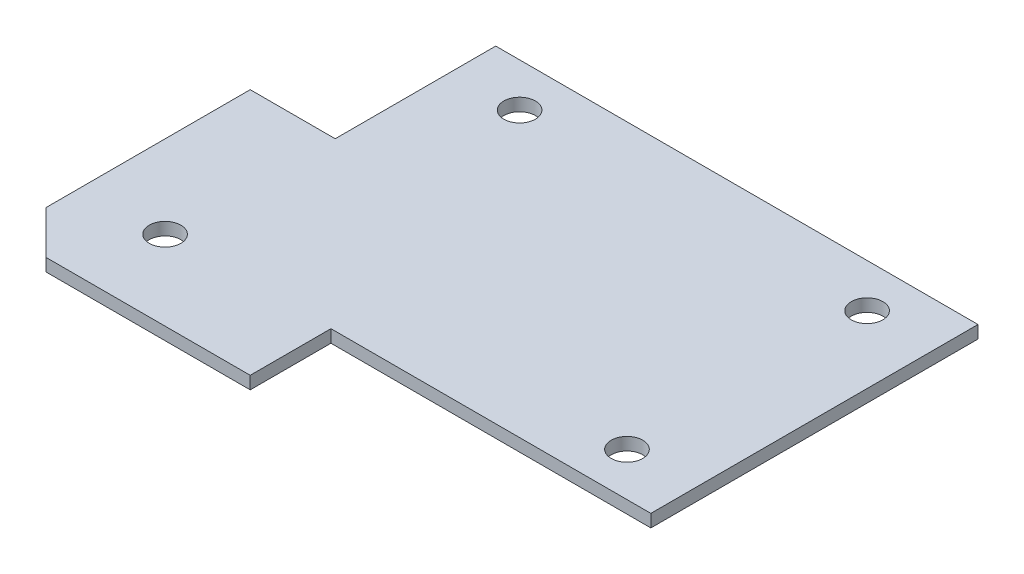
ISO-10303-21;
HEADER;
FILE_DESCRIPTION(('STEP AP214'),'2;1');
FILE_NAME('part.step','',(''),(''),'','','');
FILE_SCHEMA(('AUTOMOTIVE_DESIGN { 1 0 10303 214 1 1 1 1 }'));
ENDSEC;
DATA;
#1=APPLICATION_CONTEXT('core data for automotive mechanical design processes');
#2=APPLICATION_PROTOCOL_DEFINITION('international standard','automotive_design',2000,#1);
#3=PRODUCT_CONTEXT('',#1,'mechanical');
#4=PRODUCT('Part','Part','',(#3));
#5=PRODUCT_RELATED_PRODUCT_CATEGORY('part','',(#4));
#6=PRODUCT_DEFINITION_FORMATION('','',#4);
#7=PRODUCT_DEFINITION_CONTEXT('part definition',#1,'design');
#8=PRODUCT_DEFINITION('design','',#6,#7);
#9=PRODUCT_DEFINITION_SHAPE('','',#8);
#10=(LENGTH_UNIT() NAMED_UNIT(*) SI_UNIT(.MILLI.,.METRE.));
#11=(NAMED_UNIT(*) PLANE_ANGLE_UNIT() SI_UNIT($,.RADIAN.));
#12=(NAMED_UNIT(*) SI_UNIT($,.STERADIAN.) SOLID_ANGLE_UNIT());
#13=UNCERTAINTY_MEASURE_WITH_UNIT(LENGTH_MEASURE(1.E-05),#10,'distance_accuracy_value','');
#14=(GEOMETRIC_REPRESENTATION_CONTEXT(3) GLOBAL_UNCERTAINTY_ASSIGNED_CONTEXT((#13)) GLOBAL_UNIT_ASSIGNED_CONTEXT((#10,
#11,#12)) REPRESENTATION_CONTEXT('',''));
#15=CARTESIAN_POINT('',(0.,0.,0.));
#16=DIRECTION('',(0.,0.,1.));
#17=DIRECTION('',(1.,0.,0.));
#18=AXIS2_PLACEMENT_3D('',#15,#16,#17);
#19=CARTESIAN_POINT('',(-29.4806035931873,4.,-0.0264334137700193));
#20=DIRECTION('',(1.,0.,0.));
#21=DIRECTION('',(0.,0.,-1.));
#22=AXIS2_PLACEMENT_3D('',#19,#20,#21);
#23=PLANE('',#22);
#24=DIRECTION('',(0.,0.,1.));
#25=VECTOR('',#24,1.);
#26=CARTESIAN_POINT('',(-29.4806035931873,2.,-0.0264334137700193));
#27=LINE('',#26,#25);
#28=CARTESIAN_POINT('',(-29.4806035931873,2.,-25.4359182046136));
#29=VERTEX_POINT('',#28);
#30=CARTESIAN_POINT('',(-29.4806035931873,2.,-0.0264334137700193));
#31=VERTEX_POINT('',#30);
#32=EDGE_CURVE('E55',#29,#31,#27,.T.);
#33=ORIENTED_EDGE('',*,*,#32,.T.);
#34=DIRECTION('',(0.,-1.,0.));
#35=VECTOR('',#34,1.);
#36=CARTESIAN_POINT('',(-29.4806035931873,4.,-0.0264334137700193));
#37=LINE('',#36,#35);
#38=CARTESIAN_POINT('',(-29.4806035931873,4.,-0.0264334137700193));
#39=VERTEX_POINT('',#38);
#40=EDGE_CURVE('E11',#39,#31,#37,.T.);
#41=ORIENTED_EDGE('',*,*,#40,.F.);
#42=DIRECTION('',(0.,0.,1.));
#43=VECTOR('',#42,1.);
#44=CARTESIAN_POINT('',(-29.4806035931873,4.,-0.0264334137700193));
#45=LINE('',#44,#43);
#46=CARTESIAN_POINT('',(-29.4806035931873,4.,-25.4359182046136));
#47=VERTEX_POINT('',#46);
#48=EDGE_CURVE('E152',#47,#39,#45,.T.);
#49=ORIENTED_EDGE('',*,*,#48,.F.);
#50=DIRECTION('',(0.,-1.,0.));
#51=VECTOR('',#50,1.);
#52=CARTESIAN_POINT('',(-29.4806035931873,4.,-25.4359182046136));
#53=LINE('',#52,#51);
#54=EDGE_CURVE('E167',#47,#29,#53,.T.);
#55=ORIENTED_EDGE('',*,*,#54,.T.);
#56=EDGE_LOOP('',(#33,#41,#49,#55));
#57=FACE_BOUND('',#56,.T.);
#58=ADVANCED_FACE('F41',(#57),#23,.F.);
#59=CARTESIAN_POINT('',(-42.9335057092703,4.,-0.0264334137700193));
#60=DIRECTION('',(0.,0.,1.));
#61=DIRECTION('',(1.,0.,0.));
#62=AXIS2_PLACEMENT_3D('',#59,#60,#61);
#63=PLANE('',#62);
#64=DIRECTION('',(-1.,0.,0.));
#65=VECTOR('',#64,1.);
#66=CARTESIAN_POINT('',(-42.9335057092703,2.,-0.0264334137700193));
#67=LINE('',#66,#65);
#68=CARTESIAN_POINT('',(-42.9335057092703,2.,-0.0264334137700176));
#69=VERTEX_POINT('',#68);
#70=EDGE_CURVE('E169',#31,#69,#67,.T.);
#71=ORIENTED_EDGE('',*,*,#70,.T.);
#72=DIRECTION('',(0.,-1.,0.));
#73=VECTOR('',#72,1.);
#74=CARTESIAN_POINT('',(-42.9335057092703,4.,-0.0264334137700193));
#75=LINE('',#74,#73);
#76=CARTESIAN_POINT('',(-42.9335057092703,4.,-0.0264334137700193));
#77=VERTEX_POINT('',#76);
#78=EDGE_CURVE('E48',#77,#69,#75,.T.);
#79=ORIENTED_EDGE('',*,*,#78,.F.);
#80=DIRECTION('',(-1.,0.,0.));
#81=VECTOR('',#80,1.);
#82=CARTESIAN_POINT('',(-42.9335057092703,4.,-0.0264334137700193));
#83=LINE('',#82,#81);
#84=EDGE_CURVE('E154',#39,#77,#83,.T.);
#85=ORIENTED_EDGE('',*,*,#84,.F.);
#86=ORIENTED_EDGE('',*,*,#40,.T.);
#87=EDGE_LOOP('',(#71,#79,#85,#86));
#88=FACE_BOUND('',#87,.T.);
#89=ADVANCED_FACE('F201',(#88),#63,.F.);
#90=CARTESIAN_POINT('',(-42.9335057092703,4.,32.2961580116147));
#91=DIRECTION('',(1.,0.,0.));
#92=DIRECTION('',(0.,0.,-1.));
#93=AXIS2_PLACEMENT_3D('',#90,#91,#92);
#94=PLANE('',#93);
#95=DIRECTION('',(0.,0.,1.));
#96=VECTOR('',#95,1.);
#97=CARTESIAN_POINT('',(-42.9335057092703,2.,32.2961580116147));
#98=LINE('',#97,#96);
#99=CARTESIAN_POINT('',(-42.9335057092703,2.,32.2961580116147));
#100=VERTEX_POINT('',#99);
#101=EDGE_CURVE('E172',#69,#100,#98,.T.);
#102=ORIENTED_EDGE('',*,*,#101,.T.);
#103=DIRECTION('',(0.,-1.,0.));
#104=VECTOR('',#103,1.);
#105=CARTESIAN_POINT('',(-42.9335057092703,4.,32.2961580116147));
#106=LINE('',#105,#104);
#107=CARTESIAN_POINT('',(-42.9335057092703,4.,32.2961580116147));
#108=VERTEX_POINT('',#107);
#109=EDGE_CURVE('E192',#108,#100,#106,.T.);
#110=ORIENTED_EDGE('',*,*,#109,.F.);
#111=DIRECTION('',(0.,0.,1.));
#112=VECTOR('',#111,1.);
#113=CARTESIAN_POINT('',(-42.9335057092703,4.,32.2961580116147));
#114=LINE('',#113,#112);
#115=EDGE_CURVE('E156',#77,#108,#114,.T.);
#116=ORIENTED_EDGE('',*,*,#115,.F.);
#117=ORIENTED_EDGE('',*,*,#78,.T.);
#118=EDGE_LOOP('',(#102,#110,#116,#117));
#119=FACE_BOUND('',#118,.T.);
#120=ADVANCED_FACE('F198',(#119),#94,.F.);
#121=CARTESIAN_POINT('',(-36.1050785845241,4.,39.1245851363609));
#122=DIRECTION('',(0.707106781186547,0.,-0.707106781186548));
#123=DIRECTION('',(-0.707106781186548,0.,-0.707106781186547));
#124=AXIS2_PLACEMENT_3D('',#121,#122,#123);
#125=PLANE('',#124);
#126=DIRECTION('',(0.707106781186548,0.,0.707106781186547));
#127=VECTOR('',#126,1.);
#128=CARTESIAN_POINT('',(-36.1050785845241,2.,39.1245851363609));
#129=LINE('',#128,#127);
#130=CARTESIAN_POINT('',(-36.1050785845241,2.,39.1245851363609));
#131=VERTEX_POINT('',#130);
#132=EDGE_CURVE('E175',#100,#131,#129,.T.);
#133=ORIENTED_EDGE('',*,*,#132,.T.);
#134=DIRECTION('',(0.,-1.,0.));
#135=VECTOR('',#134,1.);
#136=CARTESIAN_POINT('',(-36.1050785845241,4.,39.1245851363609));
#137=LINE('',#136,#135);
#138=CARTESIAN_POINT('',(-36.1050785845241,4.,39.1245851363609));
#139=VERTEX_POINT('',#138);
#140=EDGE_CURVE('E189',#139,#131,#137,.T.);
#141=ORIENTED_EDGE('',*,*,#140,.F.);
#142=DIRECTION('',(0.707106781186548,0.,0.707106781186547));
#143=VECTOR('',#142,1.);
#144=CARTESIAN_POINT('',(-36.1050785845241,4.,39.1245851363609));
#145=LINE('',#144,#143);
#146=EDGE_CURVE('E158',#108,#139,#145,.T.);
#147=ORIENTED_EDGE('',*,*,#146,.F.);
#148=ORIENTED_EDGE('',*,*,#109,.T.);
#149=EDGE_LOOP('',(#133,#141,#147,#148));
#150=FACE_BOUND('',#149,.T.);
#151=ADVANCED_FACE('F205',(#150),#125,.F.);
#152=CARTESIAN_POINT('',(-3.78248715913939,4.,39.1245851363609));
#153=DIRECTION('',(0.,0.,-1.));
#154=DIRECTION('',(-1.,0.,0.));
#155=AXIS2_PLACEMENT_3D('',#152,#153,#154);
#156=PLANE('',#155);
#157=DIRECTION('',(1.,0.,0.));
#158=VECTOR('',#157,1.);
#159=CARTESIAN_POINT('',(-3.78248715913939,2.,39.1245851363609));
#160=LINE('',#159,#158);
#161=CARTESIAN_POINT('',(-3.78248715913939,2.,39.1245851363609));
#162=VERTEX_POINT('',#161);
#163=EDGE_CURVE('E178',#131,#162,#160,.T.);
#164=ORIENTED_EDGE('',*,*,#163,.T.);
#165=DIRECTION('',(0.,-1.,0.));
#166=VECTOR('',#165,1.);
#167=CARTESIAN_POINT('',(-3.78248715913939,4.,39.1245851363609));
#168=LINE('',#167,#166);
#169=CARTESIAN_POINT('',(-3.78248715913939,4.,39.1245851363609));
#170=VERTEX_POINT('',#169);
#171=EDGE_CURVE('E186',#170,#162,#168,.T.);
#172=ORIENTED_EDGE('',*,*,#171,.F.);
#173=DIRECTION('',(1.,0.,0.));
#174=VECTOR('',#173,1.);
#175=CARTESIAN_POINT('',(-3.78248715913939,4.,39.1245851363609));
#176=LINE('',#175,#174);
#177=EDGE_CURVE('E160',#139,#170,#176,.T.);
#178=ORIENTED_EDGE('',*,*,#177,.F.);
#179=ORIENTED_EDGE('',*,*,#140,.T.);
#180=EDGE_LOOP('',(#164,#172,#178,#179));
#181=FACE_BOUND('',#180,.T.);
#182=ADVANCED_FACE('F209',(#181),#156,.F.);
#183=CARTESIAN_POINT('',(-3.78248715913939,4.,26.3446667504336));
#184=DIRECTION('',(-1.,0.,0.));
#185=DIRECTION('',(0.,0.,1.));
#186=AXIS2_PLACEMENT_3D('',#183,#184,#185);
#187=PLANE('',#186);
#188=DIRECTION('',(0.,0.,-1.));
#189=VECTOR('',#188,1.);
#190=CARTESIAN_POINT('',(-3.78248715913939,2.,26.3446667504336));
#191=LINE('',#190,#189);
#192=CARTESIAN_POINT('',(-3.78248715913939,2.,26.3446667504336));
#193=VERTEX_POINT('',#192);
#194=EDGE_CURVE('E123',#162,#193,#191,.T.);
#195=ORIENTED_EDGE('',*,*,#194,.T.);
#196=DIRECTION('',(0.,-1.,0.));
#197=VECTOR('',#196,1.);
#198=CARTESIAN_POINT('',(-3.78248715913939,4.,26.3446667504336));
#199=LINE('',#198,#197);
#200=CARTESIAN_POINT('',(-3.78248715913939,4.,26.3446667504336));
#201=VERTEX_POINT('',#200);
#202=EDGE_CURVE('E120',#201,#193,#199,.T.);
#203=ORIENTED_EDGE('',*,*,#202,.F.);
#204=DIRECTION('',(0.,0.,-1.));
#205=VECTOR('',#204,1.);
#206=CARTESIAN_POINT('',(-3.78248715913939,4.,26.3446667504336));
#207=LINE('',#206,#205);
#208=EDGE_CURVE('E162',#170,#201,#207,.T.);
#209=ORIENTED_EDGE('',*,*,#208,.F.);
#210=ORIENTED_EDGE('',*,*,#171,.T.);
#211=EDGE_LOOP('',(#195,#203,#209,#210));
#212=FACE_BOUND('',#211,.T.);
#213=ADVANCED_FACE('F226',(#212),#187,.F.);
#214=CARTESIAN_POINT('',(31.8509323404461,4.,26.3446667504336));
#215=DIRECTION('',(0.,0.,-1.));
#216=DIRECTION('',(-1.,0.,0.));
#217=AXIS2_PLACEMENT_3D('',#214,#215,#216);
#218=PLANE('',#217);
#219=DIRECTION('',(1.,0.,0.));
#220=VECTOR('',#219,1.);
#221=CARTESIAN_POINT('',(31.8509323404461,2.,26.3446667504336));
#222=LINE('',#221,#220);
#223=CARTESIAN_POINT('',(46.8509323404461,2.,26.3446667504336));
#224=VERTEX_POINT('',#223);
#225=EDGE_CURVE('E112',#193,#224,#222,.T.);
#226=ORIENTED_EDGE('',*,*,#225,.T.);
#227=DIRECTION('',(0.,1.,0.));
#228=VECTOR('',#227,1.);
#229=CARTESIAN_POINT('',(46.8509323404461,-51.9094516600463,26.3446667504336));
#230=LINE('',#229,#228);
#231=CARTESIAN_POINT('',(46.8509323404461,4.,26.3446667504336));
#232=VERTEX_POINT('',#231);
#233=EDGE_CURVE('E117',#224,#232,#230,.T.);
#234=ORIENTED_EDGE('',*,*,#233,.T.);
#235=DIRECTION('',(1.,0.,0.));
#236=VECTOR('',#235,1.);
#237=CARTESIAN_POINT('',(31.8509323404461,4.,26.3446667504336));
#238=LINE('',#237,#236);
#239=EDGE_CURVE('E164',#201,#232,#238,.T.);
#240=ORIENTED_EDGE('',*,*,#239,.F.);
#241=ORIENTED_EDGE('',*,*,#202,.T.);
#242=EDGE_LOOP('',(#226,#234,#240,#241));
#243=FACE_BOUND('',#242,.T.);
#244=ADVANCED_FACE('F114',(#243),#218,.F.);
#245=CARTESIAN_POINT('',(-29.4806035931873,4.,-25.4359182046136));
#246=DIRECTION('',(0.,0.,1.));
#247=DIRECTION('',(1.,0.,0.));
#248=AXIS2_PLACEMENT_3D('',#245,#246,#247);
#249=PLANE('',#248);
#250=DIRECTION('',(-1.,0.,0.));
#251=VECTOR('',#250,1.);
#252=CARTESIAN_POINT('',(-29.4806035931873,2.,-25.4359182046136));
#253=LINE('',#252,#251);
#254=CARTESIAN_POINT('',(46.8509323404461,2.,-25.4359182046136));
#255=VERTEX_POINT('',#254);
#256=EDGE_CURVE('E122',#255,#29,#253,.T.);
#257=ORIENTED_EDGE('',*,*,#256,.T.);
#258=ORIENTED_EDGE('',*,*,#54,.F.);
#259=DIRECTION('',(-1.,0.,0.));
#260=VECTOR('',#259,1.);
#261=CARTESIAN_POINT('',(-29.4806035931873,4.,-25.4359182046136));
#262=LINE('',#261,#260);
#263=CARTESIAN_POINT('',(46.8509323404461,4.,-25.4359182046136));
#264=VERTEX_POINT('',#263);
#265=EDGE_CURVE('E63',#264,#47,#262,.T.);
#266=ORIENTED_EDGE('',*,*,#265,.F.);
#267=DIRECTION('',(0.,1.,0.));
#268=VECTOR('',#267,1.);
#269=CARTESIAN_POINT('',(46.8509323404461,-51.9094516600463,-25.4359182046136));
#270=LINE('',#269,#268);
#271=EDGE_CURVE('E131',#255,#264,#270,.T.);
#272=ORIENTED_EDGE('',*,*,#271,.F.);
#273=EDGE_LOOP('',(#257,#258,#266,#272));
#274=FACE_BOUND('',#273,.T.);
#275=ADVANCED_FACE('F216',(#274),#249,.F.);
#276=CARTESIAN_POINT('',(0.,4.,0.));
#277=DIRECTION('',(0.,-1.,0.));
#278=DIRECTION('',(0.,0.,-1.));
#279=AXIS2_PLACEMENT_3D('',#276,#277,#278);
#280=PLANE('',#279);
#281=CARTESIAN_POINT('',(36.1851643736294,4.,-18.54562572709));
#282=DIRECTION('',(0.,1.,0.));
#283=DIRECTION('',(0.,0.,1.));
#284=AXIS2_PLACEMENT_3D('',#281,#282,#283);
#285=CIRCLE('',#284,2.49999999999999);
#286=CARTESIAN_POINT('',(36.1851643736294,4.,-16.04562572709));
#287=VERTEX_POINT('',#286);
#288=EDGE_CURVE('E420',#287,#287,#285,.T.);
#289=ORIENTED_EDGE('',*,*,#288,.F.);
#290=EDGE_LOOP('',(#289));
#291=FACE_BOUND('',#290,.T.);
#292=CARTESIAN_POINT('',(36.1851643736294,4.,19.45437427291));
#293=DIRECTION('',(0.,1.,0.));
#294=DIRECTION('',(0.,0.,1.));
#295=AXIS2_PLACEMENT_3D('',#292,#293,#294);
#296=CIRCLE('',#295,2.49999999999999);
#297=CARTESIAN_POINT('',(36.1851643736294,4.,21.95437427291));
#298=VERTEX_POINT('',#297);
#299=EDGE_CURVE('E417',#298,#298,#296,.T.);
#300=ORIENTED_EDGE('',*,*,#299,.F.);
#301=EDGE_LOOP('',(#300));
#302=FACE_BOUND('',#301,.T.);
#303=CARTESIAN_POINT('',(-29.8548356263706,4.,26.5291378794875));
#304=DIRECTION('',(0.,1.,0.));
#305=DIRECTION('',(0.,0.,1.));
#306=AXIS2_PLACEMENT_3D('',#303,#304,#305);
#307=CIRCLE('',#306,2.5);
#308=CARTESIAN_POINT('',(-29.8548356263706,4.,29.0291378794875));
#309=VERTEX_POINT('',#308);
#310=EDGE_CURVE('E146',#309,#309,#307,.T.);
#311=ORIENTED_EDGE('',*,*,#310,.F.);
#312=EDGE_LOOP('',(#311));
#313=FACE_BOUND('',#312,.T.);
#314=CARTESIAN_POINT('',(-18.8148356263706,4.,-18.54562572709));
#315=DIRECTION('',(0.,1.,0.));
#316=DIRECTION('',(0.,0.,1.));
#317=AXIS2_PLACEMENT_3D('',#314,#315,#316);
#318=CIRCLE('',#317,2.5);
#319=CARTESIAN_POINT('',(-18.8148356263706,4.,-16.04562572709));
#320=VERTEX_POINT('',#319);
#321=EDGE_CURVE('E140',#320,#320,#318,.T.);
#322=ORIENTED_EDGE('',*,*,#321,.F.);
#323=EDGE_LOOP('',(#322));
#324=FACE_BOUND('',#323,.T.);
#325=ORIENTED_EDGE('',*,*,#48,.T.);
#326=ORIENTED_EDGE('',*,*,#84,.T.);
#327=ORIENTED_EDGE('',*,*,#115,.T.);
#328=ORIENTED_EDGE('',*,*,#146,.T.);
#329=ORIENTED_EDGE('',*,*,#177,.T.);
#330=ORIENTED_EDGE('',*,*,#208,.T.);
#331=ORIENTED_EDGE('',*,*,#239,.T.);
#332=DIRECTION('',(0.,0.,-1.));
#333=VECTOR('',#332,1.);
#334=CARTESIAN_POINT('',(46.8509323404461,4.,-25.4359182046136));
#335=LINE('',#334,#333);
#336=EDGE_CURVE('E134',#232,#264,#335,.T.);
#337=ORIENTED_EDGE('',*,*,#336,.T.);
#338=ORIENTED_EDGE('',*,*,#265,.T.);
#339=EDGE_LOOP('',(#325,#326,#327,#328,#329,#330,#331,#337,#338));
#340=FACE_BOUND('',#339,.T.);
#341=ADVANCED_FACE('F212',(#291,#302,#313,#324,#340),#280,.F.);
#342=CARTESIAN_POINT('',(0.,2.,0.));
#343=DIRECTION('',(0.,-1.,0.));
#344=DIRECTION('',(0.,0.,-1.));
#345=AXIS2_PLACEMENT_3D('',#342,#343,#344);
#346=PLANE('',#345);
#347=CARTESIAN_POINT('',(36.1851643736294,2.,-18.54562572709));
#348=DIRECTION('',(0.,1.,0.));
#349=DIRECTION('',(0.,0.,1.));
#350=AXIS2_PLACEMENT_3D('',#347,#348,#349);
#351=CIRCLE('',#350,2.49999999999999);
#352=CARTESIAN_POINT('',(36.1851643736294,2.,-16.04562572709));
#353=VERTEX_POINT('',#352);
#354=EDGE_CURVE('E136',#353,#353,#351,.T.);
#355=ORIENTED_EDGE('',*,*,#354,.T.);
#356=EDGE_LOOP('',(#355));
#357=FACE_BOUND('',#356,.T.);
#358=CARTESIAN_POINT('',(36.1851643736294,2.,19.45437427291));
#359=DIRECTION('',(0.,1.,0.));
#360=DIRECTION('',(0.,0.,1.));
#361=AXIS2_PLACEMENT_3D('',#358,#359,#360);
#362=CIRCLE('',#361,2.49999999999999);
#363=CARTESIAN_POINT('',(36.1851643736294,2.,21.95437427291));
#364=VERTEX_POINT('',#363);
#365=EDGE_CURVE('E407',#364,#364,#362,.T.);
#366=ORIENTED_EDGE('',*,*,#365,.T.);
#367=EDGE_LOOP('',(#366));
#368=FACE_BOUND('',#367,.T.);
#369=CARTESIAN_POINT('',(-29.8548356263706,2.,26.5291378794875));
#370=DIRECTION('',(0.,1.,0.));
#371=DIRECTION('',(0.,0.,1.));
#372=AXIS2_PLACEMENT_3D('',#369,#370,#371);
#373=CIRCLE('',#372,2.5);
#374=CARTESIAN_POINT('',(-29.8548356263706,2.,29.0291378794875));
#375=VERTEX_POINT('',#374);
#376=EDGE_CURVE('E149',#375,#375,#373,.T.);
#377=ORIENTED_EDGE('',*,*,#376,.T.);
#378=EDGE_LOOP('',(#377));
#379=FACE_BOUND('',#378,.T.);
#380=CARTESIAN_POINT('',(-18.8148356263706,2.,-18.54562572709));
#381=DIRECTION('',(0.,1.,0.));
#382=DIRECTION('',(0.,0.,1.));
#383=AXIS2_PLACEMENT_3D('',#380,#381,#382);
#384=CIRCLE('',#383,2.5);
#385=CARTESIAN_POINT('',(-18.8148356263706,2.,-16.04562572709));
#386=VERTEX_POINT('',#385);
#387=EDGE_CURVE('E143',#386,#386,#384,.T.);
#388=ORIENTED_EDGE('',*,*,#387,.T.);
#389=EDGE_LOOP('',(#388));
#390=FACE_BOUND('',#389,.T.);
#391=ORIENTED_EDGE('',*,*,#32,.F.);
#392=ORIENTED_EDGE('',*,*,#256,.F.);
#393=DIRECTION('',(0.,0.,-1.));
#394=VECTOR('',#393,1.);
#395=CARTESIAN_POINT('',(46.8509323404461,2.,-25.4359182046136));
#396=LINE('',#395,#394);
#397=EDGE_CURVE('E126',#224,#255,#396,.T.);
#398=ORIENTED_EDGE('',*,*,#397,.F.);
#399=ORIENTED_EDGE('',*,*,#225,.F.);
#400=ORIENTED_EDGE('',*,*,#194,.F.);
#401=ORIENTED_EDGE('',*,*,#163,.F.);
#402=ORIENTED_EDGE('',*,*,#132,.F.);
#403=ORIENTED_EDGE('',*,*,#101,.F.);
#404=ORIENTED_EDGE('',*,*,#70,.F.);
#405=EDGE_LOOP('',(#391,#392,#398,#399,#400,#401,#402,#403,#404));
#406=FACE_BOUND('',#405,.T.);
#407=ADVANCED_FACE('F127',(#357,#368,#379,#390,#406),#346,.T.);
#408=CARTESIAN_POINT('',(-18.8148356263706,2.,-18.54562572709));
#409=DIRECTION('',(0.,1.,0.));
#410=DIRECTION('',(0.,0.,1.));
#411=AXIS2_PLACEMENT_3D('',#408,#409,#410);
#412=CYLINDRICAL_SURFACE('',#411,2.5);
#413=ORIENTED_EDGE('',*,*,#387,.F.);
#414=EDGE_LOOP('',(#413));
#415=FACE_BOUND('',#414,.T.);
#416=ORIENTED_EDGE('',*,*,#321,.T.);
#417=EDGE_LOOP('',(#416));
#418=FACE_BOUND('',#417,.T.);
#419=ADVANCED_FACE('F251',(#415,#418),#412,.F.);
#420=CARTESIAN_POINT('',(-29.8548356263706,2.,26.5291378794875));
#421=DIRECTION('',(0.,1.,0.));
#422=DIRECTION('',(0.,0.,1.));
#423=AXIS2_PLACEMENT_3D('',#420,#421,#422);
#424=CYLINDRICAL_SURFACE('',#423,2.5);
#425=ORIENTED_EDGE('',*,*,#376,.F.);
#426=EDGE_LOOP('',(#425));
#427=FACE_BOUND('',#426,.T.);
#428=ORIENTED_EDGE('',*,*,#310,.T.);
#429=EDGE_LOOP('',(#428));
#430=FACE_BOUND('',#429,.T.);
#431=ADVANCED_FACE('F254',(#427,#430),#424,.F.);
#432=CARTESIAN_POINT('',(46.8509323404461,-51.9094516600463,-25.4359182046136));
#433=DIRECTION('',(1.,0.,0.));
#434=DIRECTION('',(0.,0.,-1.));
#435=AXIS2_PLACEMENT_3D('',#432,#433,#434);
#436=PLANE('',#435);
#437=ORIENTED_EDGE('',*,*,#233,.F.);
#438=ORIENTED_EDGE('',*,*,#397,.T.);
#439=ORIENTED_EDGE('',*,*,#271,.T.);
#440=ORIENTED_EDGE('',*,*,#336,.F.);
#441=EDGE_LOOP('',(#437,#438,#439,#440));
#442=FACE_BOUND('',#441,.T.);
#443=ADVANCED_FACE('F133',(#442),#436,.T.);
#444=CARTESIAN_POINT('',(36.1851643736294,2.,19.45437427291));
#445=DIRECTION('',(0.,1.,0.));
#446=DIRECTION('',(0.,0.,1.));
#447=AXIS2_PLACEMENT_3D('',#444,#445,#446);
#448=CYLINDRICAL_SURFACE('',#447,2.49999999999999);
#449=ORIENTED_EDGE('',*,*,#365,.F.);
#450=EDGE_LOOP('',(#449));
#451=FACE_BOUND('',#450,.T.);
#452=ORIENTED_EDGE('',*,*,#299,.T.);
#453=EDGE_LOOP('',(#452));
#454=FACE_BOUND('',#453,.T.);
#455=ADVANCED_FACE('F282',(#451,#454),#448,.F.);
#456=CARTESIAN_POINT('',(36.1851643736294,2.,-18.54562572709));
#457=DIRECTION('',(0.,1.,0.));
#458=DIRECTION('',(0.,0.,1.));
#459=AXIS2_PLACEMENT_3D('',#456,#457,#458);
#460=CYLINDRICAL_SURFACE('',#459,2.49999999999999);
#461=ORIENTED_EDGE('',*,*,#354,.F.);
#462=EDGE_LOOP('',(#461));
#463=FACE_BOUND('',#462,.T.);
#464=ORIENTED_EDGE('',*,*,#288,.T.);
#465=EDGE_LOOP('',(#464));
#466=FACE_BOUND('',#465,.T.);
#467=ADVANCED_FACE('F293',(#463,#466),#460,.F.);
#468=CLOSED_SHELL('',(#58,#89,#120,#151,#182,#213,#244,#275,#341,#407,#419,#431,#443,#455,#467));
#469=MANIFOLD_SOLID_BREP('B2',#468);
#470=ADVANCED_BREP_SHAPE_REPRESENTATION('',(#18,#469),#14);
#471=SHAPE_DEFINITION_REPRESENTATION(#9,#470);
ENDSEC;
END-ISO-10303-21;
